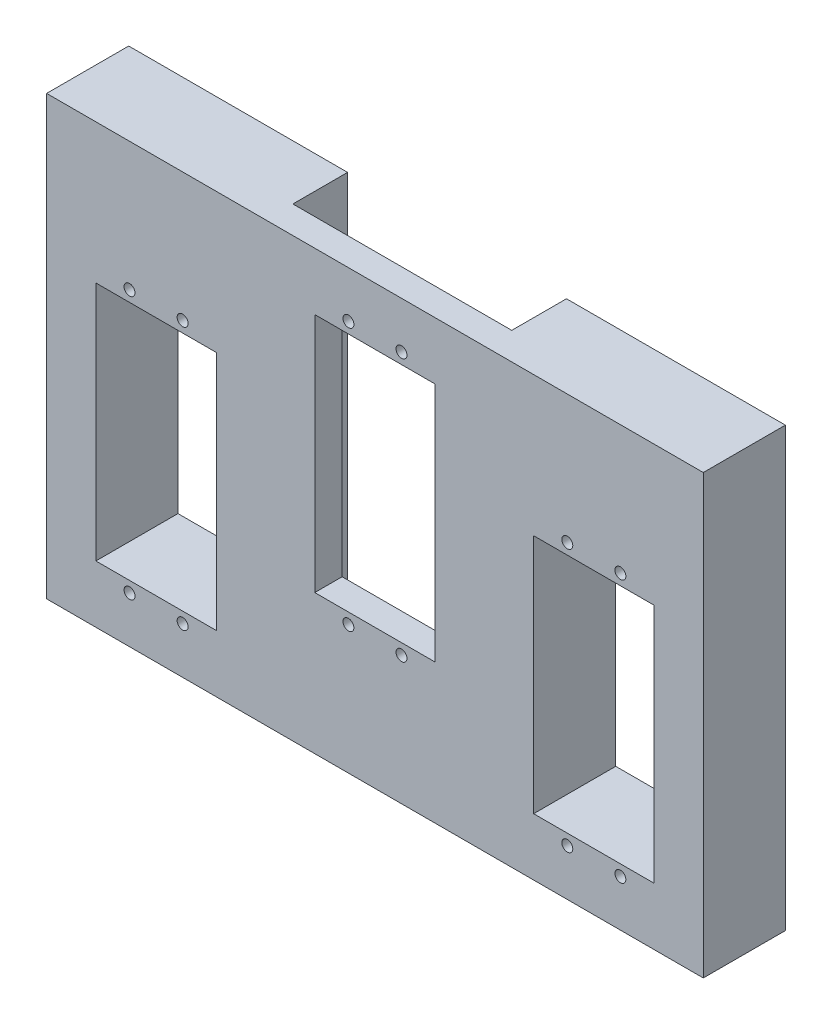
ISO-10303-21;
HEADER;
FILE_DESCRIPTION(('STEP AP214'),'2;1');
FILE_NAME('part.step','',(''),(''),'','','');
FILE_SCHEMA(('AUTOMOTIVE_DESIGN { 1 0 10303 214 1 1 1 1 }'));
ENDSEC;
DATA;
#1=APPLICATION_CONTEXT('core data for automotive mechanical design processes');
#2=APPLICATION_PROTOCOL_DEFINITION('international standard','automotive_design',2000,#1);
#3=PRODUCT_CONTEXT('',#1,'mechanical');
#4=PRODUCT('Part','Part','',(#3));
#5=PRODUCT_RELATED_PRODUCT_CATEGORY('part','',(#4));
#6=PRODUCT_DEFINITION_FORMATION('','',#4);
#7=PRODUCT_DEFINITION_CONTEXT('part definition',#1,'design');
#8=PRODUCT_DEFINITION('design','',#6,#7);
#9=PRODUCT_DEFINITION_SHAPE('','',#8);
#10=(LENGTH_UNIT() NAMED_UNIT(*) SI_UNIT(.MILLI.,.METRE.));
#11=(NAMED_UNIT(*) PLANE_ANGLE_UNIT() SI_UNIT($,.RADIAN.));
#12=(NAMED_UNIT(*) SI_UNIT($,.STERADIAN.) SOLID_ANGLE_UNIT());
#13=UNCERTAINTY_MEASURE_WITH_UNIT(LENGTH_MEASURE(1.E-05),#10,'distance_accuracy_value','');
#14=(GEOMETRIC_REPRESENTATION_CONTEXT(3) GLOBAL_UNCERTAINTY_ASSIGNED_CONTEXT((#13)) GLOBAL_UNIT_ASSIGNED_CONTEXT((#10,
#11,#12)) REPRESENTATION_CONTEXT('',''));
#15=CARTESIAN_POINT('',(0.,0.,0.));
#16=DIRECTION('',(0.,0.,1.));
#17=DIRECTION('',(1.,0.,0.));
#18=AXIS2_PLACEMENT_3D('',#15,#16,#17);
#19=CARTESIAN_POINT('',(0.,0.,-7.5));
#20=DIRECTION('',(0.,0.,1.));
#21=DIRECTION('',(1.,0.,0.));
#22=AXIS2_PLACEMENT_3D('',#19,#20,#21);
#23=PLANE('',#22);
#24=DIRECTION('',(-1.,0.,0.));
#25=VECTOR('',#24,1.);
#26=CARTESIAN_POINT('',(-50.9999999999999,-29.5,-7.5));
#27=LINE('',#26,#25);
#28=CARTESIAN_POINT('',(-28.9999999999999,-29.5,-7.5));
#29=VERTEX_POINT('',#28);
#30=CARTESIAN_POINT('',(-50.9999999999999,-29.5,-7.5));
#31=VERTEX_POINT('',#30);
#32=EDGE_CURVE('E397',#29,#31,#27,.T.);
#33=ORIENTED_EDGE('',*,*,#32,.F.);
#34=DIRECTION('',(0.,-1.,0.));
#35=VECTOR('',#34,1.);
#36=CARTESIAN_POINT('',(-28.9999999999999,-29.5,-7.5));
#37=LINE('',#36,#35);
#38=CARTESIAN_POINT('',(-28.9999999999999,14.5,-7.5));
#39=VERTEX_POINT('',#38);
#40=EDGE_CURVE('E401',#39,#29,#37,.T.);
#41=ORIENTED_EDGE('',*,*,#40,.F.);
#42=DIRECTION('',(1.,0.,0.));
#43=VECTOR('',#42,1.);
#44=CARTESIAN_POINT('',(-50.9999999999999,14.5,-7.5));
#45=LINE('',#44,#43);
#46=CARTESIAN_POINT('',(-50.9999999999999,14.5,-7.5));
#47=VERTEX_POINT('',#46);
#48=EDGE_CURVE('E404',#47,#39,#45,.T.);
#49=ORIENTED_EDGE('',*,*,#48,.F.);
#50=DIRECTION('',(0.,1.,0.));
#51=VECTOR('',#50,1.);
#52=CARTESIAN_POINT('',(-50.9999999999999,-29.5,-7.5));
#53=LINE('',#52,#51);
#54=EDGE_CURVE('E393',#31,#47,#53,.T.);
#55=ORIENTED_EDGE('',*,*,#54,.F.);
#56=EDGE_LOOP('',(#33,#41,#49,#55));
#57=FACE_BOUND('',#56,.T.);
#58=CARTESIAN_POINT('',(-44.8499999999999,16.5,-7.5));
#59=DIRECTION('',(0.,0.,1.));
#60=DIRECTION('',(1.,0.,0.));
#61=AXIS2_PLACEMENT_3D('',#58,#59,#60);
#62=CIRCLE('',#61,0.999999999999998);
#63=CARTESIAN_POINT('',(-43.8499999999999,16.5,-7.5));
#64=VERTEX_POINT('',#63);
#65=EDGE_CURVE('E318',#64,#64,#62,.F.);
#66=ORIENTED_EDGE('',*,*,#65,.F.);
#67=EDGE_LOOP('',(#66));
#68=FACE_BOUND('',#67,.T.);
#69=CARTESIAN_POINT('',(-35.1499999999999,16.5,-7.5));
#70=DIRECTION('',(0.,0.,1.));
#71=DIRECTION('',(1.,0.,0.));
#72=AXIS2_PLACEMENT_3D('',#69,#70,#71);
#73=CIRCLE('',#72,0.999999999999998);
#74=CARTESIAN_POINT('',(-34.1499999999999,16.5,-7.5));
#75=VERTEX_POINT('',#74);
#76=EDGE_CURVE('E310',#75,#75,#73,.F.);
#77=ORIENTED_EDGE('',*,*,#76,.F.);
#78=EDGE_LOOP('',(#77));
#79=FACE_BOUND('',#78,.T.);
#80=CARTESIAN_POINT('',(-35.1499999999999,-31.5,-7.5));
#81=DIRECTION('',(0.,0.,1.));
#82=DIRECTION('',(1.,0.,0.));
#83=AXIS2_PLACEMENT_3D('',#80,#81,#82);
#84=CIRCLE('',#83,0.999999999999998);
#85=CARTESIAN_POINT('',(-34.1499999999999,-31.5,-7.5));
#86=VERTEX_POINT('',#85);
#87=EDGE_CURVE('E301',#86,#86,#84,.F.);
#88=ORIENTED_EDGE('',*,*,#87,.F.);
#89=EDGE_LOOP('',(#88));
#90=FACE_BOUND('',#89,.T.);
#91=CARTESIAN_POINT('',(-44.8499999999999,-31.5,-7.5));
#92=DIRECTION('',(0.,0.,1.));
#93=DIRECTION('',(1.,0.,0.));
#94=AXIS2_PLACEMENT_3D('',#91,#92,#93);
#95=CIRCLE('',#94,0.999999999999998);
#96=CARTESIAN_POINT('',(-43.8499999999999,-31.5,-7.5));
#97=VERTEX_POINT('',#96);
#98=EDGE_CURVE('E300',#97,#97,#95,.F.);
#99=ORIENTED_EDGE('',*,*,#98,.F.);
#100=EDGE_LOOP('',(#99));
#101=FACE_BOUND('',#100,.T.);
#102=DIRECTION('',(-1.,0.,0.));
#103=VECTOR('',#102,1.);
#104=CARTESIAN_POINT('',(60.,40.,-7.5));
#105=LINE('',#104,#103);
#106=CARTESIAN_POINT('',(-20.,40.,-7.5));
#107=VERTEX_POINT('',#106);
#108=CARTESIAN_POINT('',(-60.,40.,-7.5));
#109=VERTEX_POINT('',#108);
#110=EDGE_CURVE('E460',#107,#109,#105,.T.);
#111=ORIENTED_EDGE('',*,*,#110,.F.);
#112=DIRECTION('',(0.,1.,0.));
#113=VECTOR('',#112,1.);
#114=CARTESIAN_POINT('',(-20.,-81.2310562561766,-7.5));
#115=LINE('',#114,#113);
#116=CARTESIAN_POINT('',(-20.,-40.,-7.5));
#117=VERTEX_POINT('',#116);
#118=EDGE_CURVE('E193',#117,#107,#115,.T.);
#119=ORIENTED_EDGE('',*,*,#118,.F.);
#120=DIRECTION('',(1.,0.,0.));
#121=VECTOR('',#120,1.);
#122=CARTESIAN_POINT('',(60.,-40.,-7.5));
#123=LINE('',#122,#121);
#124=CARTESIAN_POINT('',(-60.,-40.,-7.5));
#125=VERTEX_POINT('',#124);
#126=EDGE_CURVE('E453',#125,#117,#123,.T.);
#127=ORIENTED_EDGE('',*,*,#126,.F.);
#128=DIRECTION('',(0.,-1.,0.));
#129=VECTOR('',#128,1.);
#130=CARTESIAN_POINT('',(-60.,-40.,-7.5));
#131=LINE('',#130,#129);
#132=EDGE_CURVE('E433',#109,#125,#131,.T.);
#133=ORIENTED_EDGE('',*,*,#132,.F.);
#134=EDGE_LOOP('',(#111,#119,#127,#133));
#135=FACE_BOUND('',#134,.T.);
#136=ADVANCED_FACE('F39',(#57,#68,#79,#90,#101,#135),#23,.F.);
#137=CARTESIAN_POINT('',(-60.,-40.,7.5));
#138=DIRECTION('',(1.,0.,0.));
#139=DIRECTION('',(0.,0.,-1.));
#140=AXIS2_PLACEMENT_3D('',#137,#138,#139);
#141=PLANE('',#140);
#142=ORIENTED_EDGE('',*,*,#132,.T.);
#143=DIRECTION('',(0.,0.,-1.));
#144=VECTOR('',#143,1.);
#145=CARTESIAN_POINT('',(-60.,-40.,7.5));
#146=LINE('',#145,#144);
#147=CARTESIAN_POINT('',(-60.,-40.,7.5));
#148=VERTEX_POINT('',#147);
#149=EDGE_CURVE('E48',#148,#125,#146,.T.);
#150=ORIENTED_EDGE('',*,*,#149,.F.);
#151=DIRECTION('',(0.,-1.,0.));
#152=VECTOR('',#151,1.);
#153=CARTESIAN_POINT('',(-60.,-40.,7.5));
#154=LINE('',#153,#152);
#155=CARTESIAN_POINT('',(-60.,40.,7.5));
#156=VERTEX_POINT('',#155);
#157=EDGE_CURVE('E434',#156,#148,#154,.T.);
#158=ORIENTED_EDGE('',*,*,#157,.F.);
#159=DIRECTION('',(0.,0.,-1.));
#160=VECTOR('',#159,1.);
#161=CARTESIAN_POINT('',(-60.,40.,7.5));
#162=LINE('',#161,#160);
#163=EDGE_CURVE('E448',#156,#109,#162,.T.);
#164=ORIENTED_EDGE('',*,*,#163,.T.);
#165=EDGE_LOOP('',(#142,#150,#158,#164));
#166=FACE_BOUND('',#165,.T.);
#167=ADVANCED_FACE('F41',(#166),#141,.F.);
#168=CARTESIAN_POINT('',(60.,-40.,7.5));
#169=DIRECTION('',(0.,1.,0.));
#170=DIRECTION('',(-1.,0.,0.));
#171=AXIS2_PLACEMENT_3D('',#168,#169,#170);
#172=PLANE('',#171);
#173=ORIENTED_EDGE('',*,*,#126,.T.);
#174=DIRECTION('',(0.,0.,-1.));
#175=VECTOR('',#174,1.);
#176=CARTESIAN_POINT('',(-20.,-40.,2.5));
#177=LINE('',#176,#175);
#178=CARTESIAN_POINT('',(-20.,-40.,2.5));
#179=VERTEX_POINT('',#178);
#180=EDGE_CURVE('E217',#179,#117,#177,.T.);
#181=ORIENTED_EDGE('',*,*,#180,.F.);
#182=DIRECTION('',(-1.,0.,0.));
#183=VECTOR('',#182,1.);
#184=CARTESIAN_POINT('',(20.,-40.,2.5));
#185=LINE('',#184,#183);
#186=CARTESIAN_POINT('',(20.,-40.,2.5));
#187=VERTEX_POINT('',#186);
#188=EDGE_CURVE('E183',#187,#179,#185,.T.);
#189=ORIENTED_EDGE('',*,*,#188,.F.);
#190=DIRECTION('',(0.,0.,1.));
#191=VECTOR('',#190,1.);
#192=CARTESIAN_POINT('',(20.,-40.,2.5));
#193=LINE('',#192,#191);
#194=CARTESIAN_POINT('',(20.,-40.,-7.5));
#195=VERTEX_POINT('',#194);
#196=EDGE_CURVE('E208',#195,#187,#193,.T.);
#197=ORIENTED_EDGE('',*,*,#196,.F.);
#198=CARTESIAN_POINT('',(60.,-40.,-7.5));
#199=VERTEX_POINT('',#198);
#200=EDGE_CURVE('E452',#195,#199,#123,.T.);
#201=ORIENTED_EDGE('',*,*,#200,.T.);
#202=DIRECTION('',(0.,0.,-1.));
#203=VECTOR('',#202,1.);
#204=CARTESIAN_POINT('',(60.,-40.,7.5));
#205=LINE('',#204,#203);
#206=CARTESIAN_POINT('',(60.,-40.,7.5));
#207=VERTEX_POINT('',#206);
#208=EDGE_CURVE('E470',#207,#199,#205,.T.);
#209=ORIENTED_EDGE('',*,*,#208,.F.);
#210=DIRECTION('',(1.,0.,0.));
#211=VECTOR('',#210,1.);
#212=CARTESIAN_POINT('',(60.,-40.,7.5));
#213=LINE('',#212,#211);
#214=EDGE_CURVE('E438',#148,#207,#213,.T.);
#215=ORIENTED_EDGE('',*,*,#214,.F.);
#216=ORIENTED_EDGE('',*,*,#149,.T.);
#217=EDGE_LOOP('',(#173,#181,#189,#197,#201,#209,#215,#216));
#218=FACE_BOUND('',#217,.T.);
#219=ADVANCED_FACE('F477',(#218),#172,.F.);
#220=CARTESIAN_POINT('',(60.,-40.,7.5));
#221=DIRECTION('',(-1.,0.,0.));
#222=DIRECTION('',(0.,-1.,0.));
#223=AXIS2_PLACEMENT_3D('',#220,#221,#222);
#224=PLANE('',#223);
#225=DIRECTION('',(0.,1.,0.));
#226=VECTOR('',#225,1.);
#227=CARTESIAN_POINT('',(60.,-40.,-7.5));
#228=LINE('',#227,#226);
#229=CARTESIAN_POINT('',(60.,40.,-7.5));
#230=VERTEX_POINT('',#229);
#231=EDGE_CURVE('E457',#199,#230,#228,.T.);
#232=ORIENTED_EDGE('',*,*,#231,.T.);
#233=DIRECTION('',(0.,0.,-1.));
#234=VECTOR('',#233,1.);
#235=CARTESIAN_POINT('',(60.,40.,7.5));
#236=LINE('',#235,#234);
#237=CARTESIAN_POINT('',(60.,40.,7.5));
#238=VERTEX_POINT('',#237);
#239=EDGE_CURVE('E466',#238,#230,#236,.T.);
#240=ORIENTED_EDGE('',*,*,#239,.F.);
#241=DIRECTION('',(0.,1.,0.));
#242=VECTOR('',#241,1.);
#243=CARTESIAN_POINT('',(60.,-40.,7.5));
#244=LINE('',#243,#242);
#245=EDGE_CURVE('E442',#207,#238,#244,.T.);
#246=ORIENTED_EDGE('',*,*,#245,.F.);
#247=ORIENTED_EDGE('',*,*,#208,.T.);
#248=EDGE_LOOP('',(#232,#240,#246,#247));
#249=FACE_BOUND('',#248,.T.);
#250=ADVANCED_FACE('F498',(#249),#224,.F.);
#251=CARTESIAN_POINT('',(60.,40.,7.5));
#252=DIRECTION('',(0.,-1.,0.));
#253=DIRECTION('',(1.,0.,0.));
#254=AXIS2_PLACEMENT_3D('',#251,#252,#253);
#255=PLANE('',#254);
#256=DIRECTION('',(1.,0.,0.));
#257=VECTOR('',#256,1.);
#258=CARTESIAN_POINT('',(20.,40.,2.5));
#259=LINE('',#258,#257);
#260=CARTESIAN_POINT('',(-20.,40.,2.5));
#261=VERTEX_POINT('',#260);
#262=CARTESIAN_POINT('',(20.,40.,2.5));
#263=VERTEX_POINT('',#262);
#264=EDGE_CURVE('E181',#261,#263,#259,.T.);
#265=ORIENTED_EDGE('',*,*,#264,.F.);
#266=DIRECTION('',(0.,0.,1.));
#267=VECTOR('',#266,1.);
#268=CARTESIAN_POINT('',(-20.,40.,2.5));
#269=LINE('',#268,#267);
#270=EDGE_CURVE('E190',#107,#261,#269,.T.);
#271=ORIENTED_EDGE('',*,*,#270,.F.);
#272=ORIENTED_EDGE('',*,*,#110,.T.);
#273=ORIENTED_EDGE('',*,*,#163,.F.);
#274=DIRECTION('',(-1.,0.,0.));
#275=VECTOR('',#274,1.);
#276=CARTESIAN_POINT('',(60.,40.,7.5));
#277=LINE('',#276,#275);
#278=EDGE_CURVE('E445',#238,#156,#277,.T.);
#279=ORIENTED_EDGE('',*,*,#278,.F.);
#280=ORIENTED_EDGE('',*,*,#239,.T.);
#281=CARTESIAN_POINT('',(20.,40.,-7.5));
#282=VERTEX_POINT('',#281);
#283=EDGE_CURVE('E439',#230,#282,#105,.T.);
#284=ORIENTED_EDGE('',*,*,#283,.T.);
#285=DIRECTION('',(0.,0.,-1.));
#286=VECTOR('',#285,1.);
#287=CARTESIAN_POINT('',(20.,40.,2.5));
#288=LINE('',#287,#286);
#289=EDGE_CURVE('E55',#263,#282,#288,.T.);
#290=ORIENTED_EDGE('',*,*,#289,.F.);
#291=EDGE_LOOP('',(#265,#271,#272,#273,#279,#280,#284,#290));
#292=FACE_BOUND('',#291,.T.);
#293=ADVANCED_FACE('F198',(#292),#255,.F.);
#294=CARTESIAN_POINT('',(0.,0.,7.5));
#295=DIRECTION('',(0.,0.,1.));
#296=DIRECTION('',(1.,0.,0.));
#297=AXIS2_PLACEMENT_3D('',#294,#295,#296);
#298=PLANE('',#297);
#299=CARTESIAN_POINT('',(-44.8499999999999,-31.5,7.5));
#300=DIRECTION('',(0.,0.,1.));
#301=DIRECTION('',(1.,0.,0.));
#302=AXIS2_PLACEMENT_3D('',#299,#300,#301);
#303=CIRCLE('',#302,0.999999999999998);
#304=CARTESIAN_POINT('',(-43.8499999999999,-31.5,7.5));
#305=VERTEX_POINT('',#304);
#306=EDGE_CURVE('E296',#305,#305,#303,.T.);
#307=ORIENTED_EDGE('',*,*,#306,.F.);
#308=EDGE_LOOP('',(#307));
#309=FACE_BOUND('',#308,.T.);
#310=CARTESIAN_POINT('',(-35.1499999999999,-31.5,7.5));
#311=DIRECTION('',(0.,0.,1.));
#312=DIRECTION('',(1.,0.,0.));
#313=AXIS2_PLACEMENT_3D('',#310,#311,#312);
#314=CIRCLE('',#313,0.999999999999998);
#315=CARTESIAN_POINT('',(-34.1499999999999,-31.5,7.5));
#316=VERTEX_POINT('',#315);
#317=EDGE_CURVE('E306',#316,#316,#314,.T.);
#318=ORIENTED_EDGE('',*,*,#317,.F.);
#319=EDGE_LOOP('',(#318));
#320=FACE_BOUND('',#319,.T.);
#321=CARTESIAN_POINT('',(-35.1499999999999,16.5,7.5));
#322=DIRECTION('',(0.,0.,1.));
#323=DIRECTION('',(1.,0.,0.));
#324=AXIS2_PLACEMENT_3D('',#321,#322,#323);
#325=CIRCLE('',#324,0.999999999999998);
#326=CARTESIAN_POINT('',(-34.1499999999999,16.5,7.5));
#327=VERTEX_POINT('',#326);
#328=EDGE_CURVE('E314',#327,#327,#325,.T.);
#329=ORIENTED_EDGE('',*,*,#328,.F.);
#330=EDGE_LOOP('',(#329));
#331=FACE_BOUND('',#330,.T.);
#332=CARTESIAN_POINT('',(-44.8499999999999,16.5,7.5));
#333=DIRECTION('',(0.,0.,1.));
#334=DIRECTION('',(1.,0.,0.));
#335=AXIS2_PLACEMENT_3D('',#332,#333,#334);
#336=CIRCLE('',#335,0.999999999999998);
#337=CARTESIAN_POINT('',(-43.8499999999999,16.5,7.5));
#338=VERTEX_POINT('',#337);
#339=EDGE_CURVE('E322',#338,#338,#336,.T.);
#340=ORIENTED_EDGE('',*,*,#339,.F.);
#341=EDGE_LOOP('',(#340));
#342=FACE_BOUND('',#341,.T.);
#343=CARTESIAN_POINT('',(44.8499999999999,16.5,7.5));
#344=DIRECTION('',(0.,0.,1.));
#345=DIRECTION('',(1.,0.,0.));
#346=AXIS2_PLACEMENT_3D('',#343,#344,#345);
#347=CIRCLE('',#346,0.999999999999998);
#348=CARTESIAN_POINT('',(45.8499999999999,16.5,7.5));
#349=VERTEX_POINT('',#348);
#350=EDGE_CURVE('E253',#349,#349,#347,.T.);
#351=ORIENTED_EDGE('',*,*,#350,.F.);
#352=EDGE_LOOP('',(#351));
#353=FACE_BOUND('',#352,.T.);
#354=CARTESIAN_POINT('',(44.8499999999999,-31.5,7.5));
#355=DIRECTION('',(0.,0.,1.));
#356=DIRECTION('',(1.,0.,0.));
#357=AXIS2_PLACEMENT_3D('',#354,#355,#356);
#358=CIRCLE('',#357,0.999999999999998);
#359=CARTESIAN_POINT('',(45.8499999999999,-31.5,7.5));
#360=VERTEX_POINT('',#359);
#361=EDGE_CURVE('E330',#360,#360,#358,.T.);
#362=ORIENTED_EDGE('',*,*,#361,.F.);
#363=EDGE_LOOP('',(#362));
#364=FACE_BOUND('',#363,.T.);
#365=CARTESIAN_POINT('',(35.1499999999999,-31.5,7.5));
#366=DIRECTION('',(0.,0.,1.));
#367=DIRECTION('',(1.,0.,0.));
#368=AXIS2_PLACEMENT_3D('',#365,#366,#367);
#369=CIRCLE('',#368,0.999999999999998);
#370=CARTESIAN_POINT('',(36.1499999999999,-31.5,7.5));
#371=VERTEX_POINT('',#370);
#372=EDGE_CURVE('E339',#371,#371,#369,.T.);
#373=ORIENTED_EDGE('',*,*,#372,.F.);
#374=EDGE_LOOP('',(#373));
#375=FACE_BOUND('',#374,.T.);
#376=DIRECTION('',(0.,1.,0.));
#377=VECTOR('',#376,1.);
#378=CARTESIAN_POINT('',(50.9999999999999,-29.5,7.5));
#379=LINE('',#378,#377);
#380=CARTESIAN_POINT('',(50.9999999999999,-29.5,7.5));
#381=VERTEX_POINT('',#380);
#382=CARTESIAN_POINT('',(50.9999999999999,14.5,7.5));
#383=VERTEX_POINT('',#382);
#384=EDGE_CURVE('E357',#381,#383,#379,.T.);
#385=ORIENTED_EDGE('',*,*,#384,.F.);
#386=DIRECTION('',(1.,0.,0.));
#387=VECTOR('',#386,1.);
#388=CARTESIAN_POINT('',(28.9999999999999,-29.5,7.5));
#389=LINE('',#388,#387);
#390=CARTESIAN_POINT('',(28.9999999999999,-29.5,7.5));
#391=VERTEX_POINT('',#390);
#392=EDGE_CURVE('E369',#391,#381,#389,.T.);
#393=ORIENTED_EDGE('',*,*,#392,.F.);
#394=DIRECTION('',(0.,-1.,0.));
#395=VECTOR('',#394,1.);
#396=CARTESIAN_POINT('',(28.9999999999999,-29.5,7.5));
#397=LINE('',#396,#395);
#398=CARTESIAN_POINT('',(28.9999999999999,14.5,7.5));
#399=VERTEX_POINT('',#398);
#400=EDGE_CURVE('E365',#399,#391,#397,.T.);
#401=ORIENTED_EDGE('',*,*,#400,.F.);
#402=DIRECTION('',(-1.,0.,0.));
#403=VECTOR('',#402,1.);
#404=CARTESIAN_POINT('',(28.9999999999999,14.5,7.5));
#405=LINE('',#404,#403);
#406=EDGE_CURVE('E360',#383,#399,#405,.T.);
#407=ORIENTED_EDGE('',*,*,#406,.F.);
#408=EDGE_LOOP('',(#385,#393,#401,#407));
#409=FACE_BOUND('',#408,.T.);
#410=CARTESIAN_POINT('',(35.1499999999999,16.5,7.5));
#411=DIRECTION('',(0.,0.,1.));
#412=DIRECTION('',(1.,0.,0.));
#413=AXIS2_PLACEMENT_3D('',#410,#411,#412);
#414=CIRCLE('',#413,0.999999999999998);
#415=CARTESIAN_POINT('',(36.1499999999999,16.5,7.5));
#416=VERTEX_POINT('',#415);
#417=EDGE_CURVE('E244',#416,#416,#414,.T.);
#418=ORIENTED_EDGE('',*,*,#417,.F.);
#419=EDGE_LOOP('',(#418));
#420=FACE_BOUND('',#419,.T.);
#421=DIRECTION('',(0.,1.,0.));
#422=VECTOR('',#421,1.);
#423=CARTESIAN_POINT('',(11.0000000000001,-14.5,7.5));
#424=LINE('',#423,#422);
#425=CARTESIAN_POINT('',(11.0000000000001,-14.5,7.5));
#426=VERTEX_POINT('',#425);
#427=CARTESIAN_POINT('',(11.0000000000001,29.5,7.5));
#428=VERTEX_POINT('',#427);
#429=EDGE_CURVE('E254',#426,#428,#424,.T.);
#430=ORIENTED_EDGE('',*,*,#429,.F.);
#431=DIRECTION('',(1.,0.,0.));
#432=VECTOR('',#431,1.);
#433=CARTESIAN_POINT('',(-10.9999999999999,-14.5,7.5));
#434=LINE('',#433,#432);
#435=CARTESIAN_POINT('',(-10.9999999999999,-14.5,7.5));
#436=VERTEX_POINT('',#435);
#437=EDGE_CURVE('E267',#436,#426,#434,.T.);
#438=ORIENTED_EDGE('',*,*,#437,.F.);
#439=DIRECTION('',(0.,-1.,0.));
#440=VECTOR('',#439,1.);
#441=CARTESIAN_POINT('',(-10.9999999999999,-14.5,7.5));
#442=LINE('',#441,#440);
#443=CARTESIAN_POINT('',(-10.9999999999999,29.5,7.5));
#444=VERTEX_POINT('',#443);
#445=EDGE_CURVE('E263',#444,#436,#442,.T.);
#446=ORIENTED_EDGE('',*,*,#445,.F.);
#447=DIRECTION('',(-1.,0.,0.));
#448=VECTOR('',#447,1.);
#449=CARTESIAN_POINT('',(-10.9999999999999,29.5,7.5));
#450=LINE('',#449,#448);
#451=EDGE_CURVE('E258',#428,#444,#450,.T.);
#452=ORIENTED_EDGE('',*,*,#451,.F.);
#453=EDGE_LOOP('',(#430,#438,#446,#452));
#454=FACE_BOUND('',#453,.T.);
#455=CARTESIAN_POINT('',(-4.84999999999986,-16.5,7.5));
#456=DIRECTION('',(0.,0.,1.));
#457=DIRECTION('',(1.,0.,0.));
#458=AXIS2_PLACEMENT_3D('',#455,#456,#457);
#459=CIRCLE('',#458,0.999999999999998);
#460=CARTESIAN_POINT('',(-3.84999999999986,-16.5,7.5));
#461=VERTEX_POINT('',#460);
#462=EDGE_CURVE('E259',#461,#461,#459,.T.);
#463=ORIENTED_EDGE('',*,*,#462,.F.);
#464=EDGE_LOOP('',(#463));
#465=FACE_BOUND('',#464,.T.);
#466=CARTESIAN_POINT('',(4.85000000000014,-16.5,7.5));
#467=DIRECTION('',(0.,0.,1.));
#468=DIRECTION('',(1.,0.,0.));
#469=AXIS2_PLACEMENT_3D('',#466,#467,#468);
#470=CIRCLE('',#469,0.999999999999998);
#471=CARTESIAN_POINT('',(5.85000000000014,-16.5,7.5));
#472=VERTEX_POINT('',#471);
#473=EDGE_CURVE('E285',#472,#472,#470,.T.);
#474=ORIENTED_EDGE('',*,*,#473,.F.);
#475=EDGE_LOOP('',(#474));
#476=FACE_BOUND('',#475,.T.);
#477=CARTESIAN_POINT('',(4.85000000000014,31.5,7.5));
#478=DIRECTION('',(0.,0.,1.));
#479=DIRECTION('',(1.,0.,0.));
#480=AXIS2_PLACEMENT_3D('',#477,#478,#479);
#481=CIRCLE('',#480,0.999999999999999);
#482=CARTESIAN_POINT('',(5.85000000000014,31.5,7.5));
#483=VERTEX_POINT('',#482);
#484=EDGE_CURVE('E289',#483,#483,#481,.T.);
#485=ORIENTED_EDGE('',*,*,#484,.F.);
#486=EDGE_LOOP('',(#485));
#487=FACE_BOUND('',#486,.T.);
#488=CARTESIAN_POINT('',(-4.84999999999986,31.5,7.5));
#489=DIRECTION('',(0.,0.,1.));
#490=DIRECTION('',(1.,0.,0.));
#491=AXIS2_PLACEMENT_3D('',#488,#489,#490);
#492=CIRCLE('',#491,0.999999999999999);
#493=CARTESIAN_POINT('',(-3.84999999999986,31.5,7.5));
#494=VERTEX_POINT('',#493);
#495=EDGE_CURVE('E243',#494,#494,#492,.T.);
#496=ORIENTED_EDGE('',*,*,#495,.F.);
#497=EDGE_LOOP('',(#496));
#498=FACE_BOUND('',#497,.T.);
#499=DIRECTION('',(0.,1.,0.));
#500=VECTOR('',#499,1.);
#501=CARTESIAN_POINT('',(-28.9999999999999,-29.5,7.5));
#502=LINE('',#501,#500);
#503=CARTESIAN_POINT('',(-28.9999999999999,-29.5,7.5));
#504=VERTEX_POINT('',#503);
#505=CARTESIAN_POINT('',(-28.9999999999999,14.5,7.5));
#506=VERTEX_POINT('',#505);
#507=EDGE_CURVE('E305',#504,#506,#502,.T.);
#508=ORIENTED_EDGE('',*,*,#507,.F.);
#509=DIRECTION('',(1.,0.,0.));
#510=VECTOR('',#509,1.);
#511=CARTESIAN_POINT('',(-50.9999999999999,-29.5,7.5));
#512=LINE('',#511,#510);
#513=CARTESIAN_POINT('',(-50.9999999999999,-29.5,7.5));
#514=VERTEX_POINT('',#513);
#515=EDGE_CURVE('E415',#514,#504,#512,.T.);
#516=ORIENTED_EDGE('',*,*,#515,.F.);
#517=DIRECTION('',(0.,-1.,0.));
#518=VECTOR('',#517,1.);
#519=CARTESIAN_POINT('',(-50.9999999999999,-29.5,7.5));
#520=LINE('',#519,#518);
#521=CARTESIAN_POINT('',(-50.9999999999999,14.5,7.5));
#522=VERTEX_POINT('',#521);
#523=EDGE_CURVE('E411',#522,#514,#520,.T.);
#524=ORIENTED_EDGE('',*,*,#523,.F.);
#525=DIRECTION('',(-1.,0.,0.));
#526=VECTOR('',#525,1.);
#527=CARTESIAN_POINT('',(-50.9999999999999,14.5,7.5));
#528=LINE('',#527,#526);
#529=EDGE_CURVE('E407',#506,#522,#528,.T.);
#530=ORIENTED_EDGE('',*,*,#529,.F.);
#531=EDGE_LOOP('',(#508,#516,#524,#530));
#532=FACE_BOUND('',#531,.T.);
#533=ORIENTED_EDGE('',*,*,#157,.T.);
#534=ORIENTED_EDGE('',*,*,#214,.T.);
#535=ORIENTED_EDGE('',*,*,#245,.T.);
#536=ORIENTED_EDGE('',*,*,#278,.T.);
#537=EDGE_LOOP('',(#533,#534,#535,#536));
#538=FACE_BOUND('',#537,.T.);
#539=ADVANCED_FACE('F502',(#309,#320,#331,#342,#353,#364,#375,#409,#420,#454,#465,#476,#487,
#498,#532,#538),#298,.T.);
#540=CARTESIAN_POINT('',(44.8499999999999,16.5,-7.5));
#541=DIRECTION('',(0.,0.,1.));
#542=DIRECTION('',(1.,0.,0.));
#543=AXIS2_PLACEMENT_3D('',#540,#541,#542);
#544=CIRCLE('',#543,0.999999999999998);
#545=CARTESIAN_POINT('',(45.8499999999999,16.5,-7.5));
#546=VERTEX_POINT('',#545);
#547=EDGE_CURVE('E335',#546,#546,#544,.F.);
#548=ORIENTED_EDGE('',*,*,#547,.F.);
#549=EDGE_LOOP('',(#548));
#550=FACE_BOUND('',#549,.T.);
#551=CARTESIAN_POINT('',(44.8499999999999,-31.5,-7.5));
#552=DIRECTION('',(0.,0.,1.));
#553=DIRECTION('',(1.,0.,0.));
#554=AXIS2_PLACEMENT_3D('',#551,#552,#553);
#555=CIRCLE('',#554,0.999999999999998);
#556=CARTESIAN_POINT('',(45.8499999999999,-31.5,-7.5));
#557=VERTEX_POINT('',#556);
#558=EDGE_CURVE('E334',#557,#557,#555,.F.);
#559=ORIENTED_EDGE('',*,*,#558,.F.);
#560=EDGE_LOOP('',(#559));
#561=FACE_BOUND('',#560,.T.);
#562=CARTESIAN_POINT('',(35.1499999999999,-31.5,-7.5));
#563=DIRECTION('',(0.,0.,1.));
#564=DIRECTION('',(1.,0.,0.));
#565=AXIS2_PLACEMENT_3D('',#562,#563,#564);
#566=CIRCLE('',#565,0.999999999999998);
#567=CARTESIAN_POINT('',(36.1499999999999,-31.5,-7.5));
#568=VERTEX_POINT('',#567);
#569=EDGE_CURVE('E361',#568,#568,#566,.F.);
#570=ORIENTED_EDGE('',*,*,#569,.F.);
#571=EDGE_LOOP('',(#570));
#572=FACE_BOUND('',#571,.T.);
#573=DIRECTION('',(-1.,0.,0.));
#574=VECTOR('',#573,1.);
#575=CARTESIAN_POINT('',(28.9999999999999,-29.5,-7.5));
#576=LINE('',#575,#574);
#577=CARTESIAN_POINT('',(50.9999999999999,-29.5,-7.5));
#578=VERTEX_POINT('',#577);
#579=CARTESIAN_POINT('',(28.9999999999999,-29.5,-7.5));
#580=VERTEX_POINT('',#579);
#581=EDGE_CURVE('E350',#578,#580,#576,.T.);
#582=ORIENTED_EDGE('',*,*,#581,.F.);
#583=DIRECTION('',(0.,-1.,0.));
#584=VECTOR('',#583,1.);
#585=CARTESIAN_POINT('',(50.9999999999999,-29.5,-7.5));
#586=LINE('',#585,#584);
#587=CARTESIAN_POINT('',(50.9999999999999,14.5,-7.5));
#588=VERTEX_POINT('',#587);
#589=EDGE_CURVE('E354',#588,#578,#586,.T.);
#590=ORIENTED_EDGE('',*,*,#589,.F.);
#591=DIRECTION('',(1.,0.,0.));
#592=VECTOR('',#591,1.);
#593=CARTESIAN_POINT('',(28.9999999999999,14.5,-7.5));
#594=LINE('',#593,#592);
#595=CARTESIAN_POINT('',(28.9999999999999,14.5,-7.5));
#596=VERTEX_POINT('',#595);
#597=EDGE_CURVE('E326',#596,#588,#594,.T.);
#598=ORIENTED_EDGE('',*,*,#597,.F.);
#599=DIRECTION('',(0.,1.,0.));
#600=VECTOR('',#599,1.);
#601=CARTESIAN_POINT('',(28.9999999999999,-29.5,-7.5));
#602=LINE('',#601,#600);
#603=EDGE_CURVE('E346',#580,#596,#602,.T.);
#604=ORIENTED_EDGE('',*,*,#603,.F.);
#605=EDGE_LOOP('',(#582,#590,#598,#604));
#606=FACE_BOUND('',#605,.T.);
#607=CARTESIAN_POINT('',(35.1499999999999,16.5,-7.5));
#608=DIRECTION('',(0.,0.,1.));
#609=DIRECTION('',(1.,0.,0.));
#610=AXIS2_PLACEMENT_3D('',#607,#608,#609);
#611=CIRCLE('',#610,0.999999999999998);
#612=CARTESIAN_POINT('',(36.1499999999999,16.5,-7.5));
#613=VERTEX_POINT('',#612);
#614=EDGE_CURVE('E248',#613,#613,#611,.F.);
#615=ORIENTED_EDGE('',*,*,#614,.F.);
#616=EDGE_LOOP('',(#615));
#617=FACE_BOUND('',#616,.T.);
#618=ORIENTED_EDGE('',*,*,#200,.F.);
#619=DIRECTION('',(0.,1.,0.));
#620=VECTOR('',#619,1.);
#621=CARTESIAN_POINT('',(20.,-81.2310562561766,-7.5));
#622=LINE('',#621,#620);
#623=EDGE_CURVE('E209',#195,#282,#622,.T.);
#624=ORIENTED_EDGE('',*,*,#623,.T.);
#625=ORIENTED_EDGE('',*,*,#283,.F.);
#626=ORIENTED_EDGE('',*,*,#231,.F.);
#627=EDGE_LOOP('',(#618,#624,#625,#626));
#628=FACE_BOUND('',#627,.T.);
#629=ADVANCED_FACE('F494',(#550,#561,#572,#606,#617,#628),#23,.F.);
#630=CARTESIAN_POINT('',(-28.9999999999999,-29.5,-56.6934955049954));
#631=DIRECTION('',(1.,0.,0.));
#632=DIRECTION('',(0.,0.,-1.));
#633=AXIS2_PLACEMENT_3D('',#630,#631,#632);
#634=PLANE('',#633);
#635=ORIENTED_EDGE('',*,*,#40,.T.);
#636=DIRECTION('',(0.,0.,1.));
#637=VECTOR('',#636,1.);
#638=CARTESIAN_POINT('',(-28.9999999999999,-29.5,-56.6934955049954));
#639=LINE('',#638,#637);
#640=EDGE_CURVE('E398',#29,#504,#639,.T.);
#641=ORIENTED_EDGE('',*,*,#640,.T.);
#642=ORIENTED_EDGE('',*,*,#507,.T.);
#643=DIRECTION('',(0.,0.,1.));
#644=VECTOR('',#643,1.);
#645=CARTESIAN_POINT('',(-28.9999999999999,14.5,-56.6934955049954));
#646=LINE('',#645,#644);
#647=EDGE_CURVE('E419',#39,#506,#646,.T.);
#648=ORIENTED_EDGE('',*,*,#647,.F.);
#649=EDGE_LOOP('',(#635,#641,#642,#648));
#650=FACE_BOUND('',#649,.T.);
#651=ADVANCED_FACE('F510',(#650),#634,.F.);
#652=CARTESIAN_POINT('',(-50.9999999999999,-29.5,-56.6934955049954));
#653=DIRECTION('',(0.,-1.,0.));
#654=DIRECTION('',(0.,0.,-1.));
#655=AXIS2_PLACEMENT_3D('',#652,#653,#654);
#656=PLANE('',#655);
#657=ORIENTED_EDGE('',*,*,#32,.T.);
#658=DIRECTION('',(0.,0.,1.));
#659=VECTOR('',#658,1.);
#660=CARTESIAN_POINT('',(-50.9999999999999,-29.5,-56.6934955049954));
#661=LINE('',#660,#659);
#662=EDGE_CURVE('E422',#31,#514,#661,.T.);
#663=ORIENTED_EDGE('',*,*,#662,.T.);
#664=ORIENTED_EDGE('',*,*,#515,.T.);
#665=ORIENTED_EDGE('',*,*,#640,.F.);
#666=EDGE_LOOP('',(#657,#663,#664,#665));
#667=FACE_BOUND('',#666,.T.);
#668=ADVANCED_FACE('F711',(#667),#656,.F.);
#669=CARTESIAN_POINT('',(-50.9999999999999,-29.5,-56.6934955049954));
#670=DIRECTION('',(-1.,0.,0.));
#671=DIRECTION('',(0.,0.,1.));
#672=AXIS2_PLACEMENT_3D('',#669,#670,#671);
#673=PLANE('',#672);
#674=ORIENTED_EDGE('',*,*,#54,.T.);
#675=DIRECTION('',(0.,0.,1.));
#676=VECTOR('',#675,1.);
#677=CARTESIAN_POINT('',(-50.9999999999999,14.5,-56.6934955049954));
#678=LINE('',#677,#676);
#679=EDGE_CURVE('E425',#47,#522,#678,.T.);
#680=ORIENTED_EDGE('',*,*,#679,.T.);
#681=ORIENTED_EDGE('',*,*,#523,.T.);
#682=ORIENTED_EDGE('',*,*,#662,.F.);
#683=EDGE_LOOP('',(#674,#680,#681,#682));
#684=FACE_BOUND('',#683,.T.);
#685=ADVANCED_FACE('F714',(#684),#673,.F.);
#686=CARTESIAN_POINT('',(-50.9999999999999,14.5,-56.6934955049954));
#687=DIRECTION('',(0.,1.,0.));
#688=DIRECTION('',(0.,0.,1.));
#689=AXIS2_PLACEMENT_3D('',#686,#687,#688);
#690=PLANE('',#689);
#691=ORIENTED_EDGE('',*,*,#48,.T.);
#692=ORIENTED_EDGE('',*,*,#647,.T.);
#693=ORIENTED_EDGE('',*,*,#529,.T.);
#694=ORIENTED_EDGE('',*,*,#679,.F.);
#695=EDGE_LOOP('',(#691,#692,#693,#694));
#696=FACE_BOUND('',#695,.T.);
#697=ADVANCED_FACE('F559',(#696),#690,.F.);
#698=CARTESIAN_POINT('',(-4.84999999999986,31.5,-56.6934955049954));
#699=DIRECTION('',(0.,0.,1.));
#700=DIRECTION('',(1.,0.,0.));
#701=AXIS2_PLACEMENT_3D('',#698,#699,#700);
#702=CYLINDRICAL_SURFACE('',#701,0.999999999999999);
#703=CARTESIAN_POINT('',(-4.84999999999986,31.5,2.5));
#704=DIRECTION('',(0.,0.,1.));
#705=DIRECTION('',(1.,0.,0.));
#706=AXIS2_PLACEMENT_3D('',#703,#704,#705);
#707=CIRCLE('',#706,0.999999999999999);
#708=CARTESIAN_POINT('',(-3.84999999999986,31.5,2.5));
#709=VERTEX_POINT('',#708);
#710=EDGE_CURVE('E239',#709,#709,#707,.F.);
#711=ORIENTED_EDGE('',*,*,#710,.T.);
#712=EDGE_LOOP('',(#711));
#713=FACE_BOUND('',#712,.T.);
#714=ORIENTED_EDGE('',*,*,#495,.T.);
#715=EDGE_LOOP('',(#714));
#716=FACE_BOUND('',#715,.T.);
#717=ADVANCED_FACE('F553',(#713,#716),#702,.F.);
#718=CARTESIAN_POINT('',(4.85000000000014,31.5,-56.6934955049954));
#719=DIRECTION('',(0.,0.,1.));
#720=DIRECTION('',(1.,0.,0.));
#721=AXIS2_PLACEMENT_3D('',#718,#719,#720);
#722=CYLINDRICAL_SURFACE('',#721,0.999999999999999);
#723=CARTESIAN_POINT('',(4.85000000000014,31.5,2.5));
#724=DIRECTION('',(0.,0.,1.));
#725=DIRECTION('',(1.,0.,0.));
#726=AXIS2_PLACEMENT_3D('',#723,#724,#725);
#727=CIRCLE('',#726,0.999999999999999);
#728=CARTESIAN_POINT('',(5.85000000000014,31.5,2.5));
#729=VERTEX_POINT('',#728);
#730=EDGE_CURVE('E235',#729,#729,#727,.F.);
#731=ORIENTED_EDGE('',*,*,#730,.T.);
#732=EDGE_LOOP('',(#731));
#733=FACE_BOUND('',#732,.T.);
#734=ORIENTED_EDGE('',*,*,#484,.T.);
#735=EDGE_LOOP('',(#734));
#736=FACE_BOUND('',#735,.T.);
#737=ADVANCED_FACE('F558',(#733,#736),#722,.F.);
#738=CARTESIAN_POINT('',(4.85000000000014,-16.5,-56.6934955049954));
#739=DIRECTION('',(0.,0.,1.));
#740=DIRECTION('',(1.,0.,0.));
#741=AXIS2_PLACEMENT_3D('',#738,#739,#740);
#742=CYLINDRICAL_SURFACE('',#741,0.999999999999998);
#743=CARTESIAN_POINT('',(4.85000000000014,-16.5,2.5));
#744=DIRECTION('',(0.,0.,1.));
#745=DIRECTION('',(1.,0.,0.));
#746=AXIS2_PLACEMENT_3D('',#743,#744,#745);
#747=CIRCLE('',#746,0.999999999999998);
#748=CARTESIAN_POINT('',(5.85000000000014,-16.5,2.5));
#749=VERTEX_POINT('',#748);
#750=EDGE_CURVE('E231',#749,#749,#747,.F.);
#751=ORIENTED_EDGE('',*,*,#750,.T.);
#752=EDGE_LOOP('',(#751));
#753=FACE_BOUND('',#752,.T.);
#754=ORIENTED_EDGE('',*,*,#473,.T.);
#755=EDGE_LOOP('',(#754));
#756=FACE_BOUND('',#755,.T.);
#757=ADVANCED_FACE('F571',(#753,#756),#742,.F.);
#758=CARTESIAN_POINT('',(-4.84999999999986,-16.5,-56.6934955049954));
#759=DIRECTION('',(0.,0.,1.));
#760=DIRECTION('',(1.,0.,0.));
#761=AXIS2_PLACEMENT_3D('',#758,#759,#760);
#762=CYLINDRICAL_SURFACE('',#761,0.999999999999998);
#763=CARTESIAN_POINT('',(-4.84999999999986,-16.5,2.5));
#764=DIRECTION('',(0.,0.,1.));
#765=DIRECTION('',(1.,0.,0.));
#766=AXIS2_PLACEMENT_3D('',#763,#764,#765);
#767=CIRCLE('',#766,0.999999999999998);
#768=CARTESIAN_POINT('',(-3.84999999999986,-16.5,2.5));
#769=VERTEX_POINT('',#768);
#770=EDGE_CURVE('E227',#769,#769,#767,.F.);
#771=ORIENTED_EDGE('',*,*,#770,.T.);
#772=EDGE_LOOP('',(#771));
#773=FACE_BOUND('',#772,.T.);
#774=ORIENTED_EDGE('',*,*,#462,.T.);
#775=EDGE_LOOP('',(#774));
#776=FACE_BOUND('',#775,.T.);
#777=ADVANCED_FACE('F581',(#773,#776),#762,.F.);
#778=CARTESIAN_POINT('',(11.0000000000001,-14.5,-56.6934955049954));
#779=DIRECTION('',(1.,0.,0.));
#780=DIRECTION('',(0.,0.,-1.));
#781=AXIS2_PLACEMENT_3D('',#778,#779,#780);
#782=PLANE('',#781);
#783=DIRECTION('',(0.,0.,1.));
#784=VECTOR('',#783,1.);
#785=CARTESIAN_POINT('',(11.0000000000001,29.5,-56.6934955049954));
#786=LINE('',#785,#784);
#787=CARTESIAN_POINT('',(11.0000000000001,29.5,2.50000000000001));
#788=VERTEX_POINT('',#787);
#789=EDGE_CURVE('E271',#788,#428,#786,.T.);
#790=ORIENTED_EDGE('',*,*,#789,.F.);
#791=DIRECTION('',(0.,-1.,0.));
#792=VECTOR('',#791,1.);
#793=CARTESIAN_POINT('',(11.0000000000001,-14.5,2.5));
#794=LINE('',#793,#792);
#795=CARTESIAN_POINT('',(11.0000000000001,-14.5,2.50000000000001));
#796=VERTEX_POINT('',#795);
#797=EDGE_CURVE('E63',#788,#796,#794,.T.);
#798=ORIENTED_EDGE('',*,*,#797,.T.);
#799=DIRECTION('',(0.,0.,1.));
#800=VECTOR('',#799,1.);
#801=CARTESIAN_POINT('',(11.0000000000001,-14.5,-56.6934955049954));
#802=LINE('',#801,#800);
#803=EDGE_CURVE('E249',#796,#426,#802,.T.);
#804=ORIENTED_EDGE('',*,*,#803,.T.);
#805=ORIENTED_EDGE('',*,*,#429,.T.);
#806=EDGE_LOOP('',(#790,#798,#804,#805));
#807=FACE_BOUND('',#806,.T.);
#808=ADVANCED_FACE('F591',(#807),#782,.F.);
#809=CARTESIAN_POINT('',(-10.9999999999999,-14.5,-56.6934955049954));
#810=DIRECTION('',(0.,-1.,0.));
#811=DIRECTION('',(0.,0.,-1.));
#812=AXIS2_PLACEMENT_3D('',#809,#810,#811);
#813=PLANE('',#812);
#814=ORIENTED_EDGE('',*,*,#803,.F.);
#815=DIRECTION('',(-1.,0.,0.));
#816=VECTOR('',#815,1.);
#817=CARTESIAN_POINT('',(-10.9999999999999,-14.5,2.50000000000001));
#818=LINE('',#817,#816);
#819=CARTESIAN_POINT('',(-10.9999999999999,-14.5,2.50000000000001));
#820=VERTEX_POINT('',#819);
#821=EDGE_CURVE('E221',#796,#820,#818,.T.);
#822=ORIENTED_EDGE('',*,*,#821,.T.);
#823=DIRECTION('',(0.,0.,1.));
#824=VECTOR('',#823,1.);
#825=CARTESIAN_POINT('',(-10.9999999999999,-14.5,-56.6934955049954));
#826=LINE('',#825,#824);
#827=EDGE_CURVE('E274',#820,#436,#826,.T.);
#828=ORIENTED_EDGE('',*,*,#827,.T.);
#829=ORIENTED_EDGE('',*,*,#437,.T.);
#830=EDGE_LOOP('',(#814,#822,#828,#829));
#831=FACE_BOUND('',#830,.T.);
#832=ADVANCED_FACE('F601',(#831),#813,.F.);
#833=CARTESIAN_POINT('',(-10.9999999999999,-14.5,-56.6934955049954));
#834=DIRECTION('',(-1.,0.,0.));
#835=DIRECTION('',(0.,0.,1.));
#836=AXIS2_PLACEMENT_3D('',#833,#834,#835);
#837=PLANE('',#836);
#838=ORIENTED_EDGE('',*,*,#827,.F.);
#839=DIRECTION('',(0.,1.,0.));
#840=VECTOR('',#839,1.);
#841=CARTESIAN_POINT('',(-10.9999999999999,-14.5,2.50000000000001));
#842=LINE('',#841,#840);
#843=CARTESIAN_POINT('',(-10.9999999999999,29.5,2.50000000000001));
#844=VERTEX_POINT('',#843);
#845=EDGE_CURVE('E216',#820,#844,#842,.T.);
#846=ORIENTED_EDGE('',*,*,#845,.T.);
#847=DIRECTION('',(0.,0.,1.));
#848=VECTOR('',#847,1.);
#849=CARTESIAN_POINT('',(-10.9999999999999,29.5,-56.6934955049954));
#850=LINE('',#849,#848);
#851=EDGE_CURVE('E277',#844,#444,#850,.T.);
#852=ORIENTED_EDGE('',*,*,#851,.T.);
#853=ORIENTED_EDGE('',*,*,#445,.T.);
#854=EDGE_LOOP('',(#838,#846,#852,#853));
#855=FACE_BOUND('',#854,.T.);
#856=ADVANCED_FACE('F611',(#855),#837,.F.);
#857=CARTESIAN_POINT('',(-10.9999999999999,29.5,-56.6934955049954));
#858=DIRECTION('',(0.,1.,0.));
#859=DIRECTION('',(0.,0.,1.));
#860=AXIS2_PLACEMENT_3D('',#857,#858,#859);
#861=PLANE('',#860);
#862=ORIENTED_EDGE('',*,*,#851,.F.);
#863=DIRECTION('',(1.,0.,0.));
#864=VECTOR('',#863,1.);
#865=CARTESIAN_POINT('',(-10.9999999999999,29.5,2.50000000000001));
#866=LINE('',#865,#864);
#867=EDGE_CURVE('E11',#844,#788,#866,.T.);
#868=ORIENTED_EDGE('',*,*,#867,.T.);
#869=ORIENTED_EDGE('',*,*,#789,.T.);
#870=ORIENTED_EDGE('',*,*,#451,.T.);
#871=EDGE_LOOP('',(#862,#868,#869,#870));
#872=FACE_BOUND('',#871,.T.);
#873=ADVANCED_FACE('F621',(#872),#861,.F.);
#874=CARTESIAN_POINT('',(35.1499999999999,16.5,-56.6934955049954));
#875=DIRECTION('',(0.,0.,1.));
#876=DIRECTION('',(1.,0.,0.));
#877=AXIS2_PLACEMENT_3D('',#874,#875,#876);
#878=CYLINDRICAL_SURFACE('',#877,0.999999999999998);
#879=ORIENTED_EDGE('',*,*,#614,.T.);
#880=EDGE_LOOP('',(#879));
#881=FACE_BOUND('',#880,.T.);
#882=ORIENTED_EDGE('',*,*,#417,.T.);
#883=EDGE_LOOP('',(#882));
#884=FACE_BOUND('',#883,.T.);
#885=ADVANCED_FACE('F631',(#881,#884),#878,.F.);
#886=CARTESIAN_POINT('',(50.9999999999999,-29.5,-56.6934955049954));
#887=DIRECTION('',(1.,0.,0.));
#888=DIRECTION('',(0.,0.,-1.));
#889=AXIS2_PLACEMENT_3D('',#886,#887,#888);
#890=PLANE('',#889);
#891=ORIENTED_EDGE('',*,*,#589,.T.);
#892=DIRECTION('',(0.,0.,1.));
#893=VECTOR('',#892,1.);
#894=CARTESIAN_POINT('',(50.9999999999999,-29.5,-56.6934955049954));
#895=LINE('',#894,#893);
#896=EDGE_CURVE('E351',#578,#381,#895,.T.);
#897=ORIENTED_EDGE('',*,*,#896,.T.);
#898=ORIENTED_EDGE('',*,*,#384,.T.);
#899=DIRECTION('',(0.,0.,1.));
#900=VECTOR('',#899,1.);
#901=CARTESIAN_POINT('',(50.9999999999999,14.5,-56.6934955049954));
#902=LINE('',#901,#900);
#903=EDGE_CURVE('E373',#588,#383,#902,.T.);
#904=ORIENTED_EDGE('',*,*,#903,.F.);
#905=EDGE_LOOP('',(#891,#897,#898,#904));
#906=FACE_BOUND('',#905,.T.);
#907=ADVANCED_FACE('F667',(#906),#890,.F.);
#908=CARTESIAN_POINT('',(28.9999999999999,-29.5,-56.6934955049954));
#909=DIRECTION('',(0.,-1.,0.));
#910=DIRECTION('',(0.,0.,-1.));
#911=AXIS2_PLACEMENT_3D('',#908,#909,#910);
#912=PLANE('',#911);
#913=ORIENTED_EDGE('',*,*,#581,.T.);
#914=DIRECTION('',(0.,0.,1.));
#915=VECTOR('',#914,1.);
#916=CARTESIAN_POINT('',(28.9999999999999,-29.5,-56.6934955049954));
#917=LINE('',#916,#915);
#918=EDGE_CURVE('E376',#580,#391,#917,.T.);
#919=ORIENTED_EDGE('',*,*,#918,.T.);
#920=ORIENTED_EDGE('',*,*,#392,.T.);
#921=ORIENTED_EDGE('',*,*,#896,.F.);
#922=EDGE_LOOP('',(#913,#919,#920,#921));
#923=FACE_BOUND('',#922,.T.);
#924=ADVANCED_FACE('F693',(#923),#912,.F.);
#925=CARTESIAN_POINT('',(28.9999999999999,-29.5,-56.6934955049954));
#926=DIRECTION('',(-1.,0.,0.));
#927=DIRECTION('',(0.,0.,1.));
#928=AXIS2_PLACEMENT_3D('',#925,#926,#927);
#929=PLANE('',#928);
#930=ORIENTED_EDGE('',*,*,#603,.T.);
#931=DIRECTION('',(0.,0.,1.));
#932=VECTOR('',#931,1.);
#933=CARTESIAN_POINT('',(28.9999999999999,14.5,-56.6934955049954));
#934=LINE('',#933,#932);
#935=EDGE_CURVE('E379',#596,#399,#934,.T.);
#936=ORIENTED_EDGE('',*,*,#935,.T.);
#937=ORIENTED_EDGE('',*,*,#400,.T.);
#938=ORIENTED_EDGE('',*,*,#918,.F.);
#939=EDGE_LOOP('',(#930,#936,#937,#938));
#940=FACE_BOUND('',#939,.T.);
#941=ADVANCED_FACE('F696',(#940),#929,.F.);
#942=CARTESIAN_POINT('',(28.9999999999999,14.5,-56.6934955049954));
#943=DIRECTION('',(0.,1.,0.));
#944=DIRECTION('',(0.,0.,1.));
#945=AXIS2_PLACEMENT_3D('',#942,#943,#944);
#946=PLANE('',#945);
#947=ORIENTED_EDGE('',*,*,#597,.T.);
#948=ORIENTED_EDGE('',*,*,#903,.T.);
#949=ORIENTED_EDGE('',*,*,#406,.T.);
#950=ORIENTED_EDGE('',*,*,#935,.F.);
#951=EDGE_LOOP('',(#947,#948,#949,#950));
#952=FACE_BOUND('',#951,.T.);
#953=ADVANCED_FACE('F700',(#952),#946,.F.);
#954=CARTESIAN_POINT('',(35.1499999999999,-31.5,-56.6934955049954));
#955=DIRECTION('',(0.,0.,1.));
#956=DIRECTION('',(1.,0.,0.));
#957=AXIS2_PLACEMENT_3D('',#954,#955,#956);
#958=CYLINDRICAL_SURFACE('',#957,0.999999999999998);
#959=ORIENTED_EDGE('',*,*,#569,.T.);
#960=EDGE_LOOP('',(#959));
#961=FACE_BOUND('',#960,.T.);
#962=ORIENTED_EDGE('',*,*,#372,.T.);
#963=EDGE_LOOP('',(#962));
#964=FACE_BOUND('',#963,.T.);
#965=ADVANCED_FACE('F688',(#961,#964),#958,.F.);
#966=CARTESIAN_POINT('',(44.8499999999999,-31.5,-56.6934955049954));
#967=DIRECTION('',(0.,0.,1.));
#968=DIRECTION('',(1.,0.,0.));
#969=AXIS2_PLACEMENT_3D('',#966,#967,#968);
#970=CYLINDRICAL_SURFACE('',#969,0.999999999999998);
#971=ORIENTED_EDGE('',*,*,#558,.T.);
#972=EDGE_LOOP('',(#971));
#973=FACE_BOUND('',#972,.T.);
#974=ORIENTED_EDGE('',*,*,#361,.T.);
#975=EDGE_LOOP('',(#974));
#976=FACE_BOUND('',#975,.T.);
#977=ADVANCED_FACE('F685',(#973,#976),#970,.F.);
#978=CARTESIAN_POINT('',(44.8499999999999,16.5,-56.6934955049954));
#979=DIRECTION('',(0.,0.,1.));
#980=DIRECTION('',(1.,0.,0.));
#981=AXIS2_PLACEMENT_3D('',#978,#979,#980);
#982=CYLINDRICAL_SURFACE('',#981,0.999999999999998);
#983=ORIENTED_EDGE('',*,*,#547,.T.);
#984=EDGE_LOOP('',(#983));
#985=FACE_BOUND('',#984,.T.);
#986=ORIENTED_EDGE('',*,*,#350,.T.);
#987=EDGE_LOOP('',(#986));
#988=FACE_BOUND('',#987,.T.);
#989=ADVANCED_FACE('F683',(#985,#988),#982,.F.);
#990=CARTESIAN_POINT('',(-44.8499999999999,16.5,-56.6934955049954));
#991=DIRECTION('',(0.,0.,1.));
#992=DIRECTION('',(1.,0.,0.));
#993=AXIS2_PLACEMENT_3D('',#990,#991,#992);
#994=CYLINDRICAL_SURFACE('',#993,0.999999999999998);
#995=ORIENTED_EDGE('',*,*,#65,.T.);
#996=EDGE_LOOP('',(#995));
#997=FACE_BOUND('',#996,.T.);
#998=ORIENTED_EDGE('',*,*,#339,.T.);
#999=EDGE_LOOP('',(#998));
#1000=FACE_BOUND('',#999,.T.);
#1001=ADVANCED_FACE('F679',(#997,#1000),#994,.F.);
#1002=CARTESIAN_POINT('',(-35.1499999999999,16.5,-56.6934955049954));
#1003=DIRECTION('',(0.,0.,1.));
#1004=DIRECTION('',(1.,0.,0.));
#1005=AXIS2_PLACEMENT_3D('',#1002,#1003,#1004);
#1006=CYLINDRICAL_SURFACE('',#1005,0.999999999999998);
#1007=ORIENTED_EDGE('',*,*,#76,.T.);
#1008=EDGE_LOOP('',(#1007));
#1009=FACE_BOUND('',#1008,.T.);
#1010=ORIENTED_EDGE('',*,*,#328,.T.);
#1011=EDGE_LOOP('',(#1010));
#1012=FACE_BOUND('',#1011,.T.);
#1013=ADVANCED_FACE('F675',(#1009,#1012),#1006,.F.);
#1014=CARTESIAN_POINT('',(-35.1499999999999,-31.5,-56.6934955049954));
#1015=DIRECTION('',(0.,0.,1.));
#1016=DIRECTION('',(1.,0.,0.));
#1017=AXIS2_PLACEMENT_3D('',#1014,#1015,#1016);
#1018=CYLINDRICAL_SURFACE('',#1017,0.999999999999998);
#1019=ORIENTED_EDGE('',*,*,#87,.T.);
#1020=EDGE_LOOP('',(#1019));
#1021=FACE_BOUND('',#1020,.T.);
#1022=ORIENTED_EDGE('',*,*,#317,.T.);
#1023=EDGE_LOOP('',(#1022));
#1024=FACE_BOUND('',#1023,.T.);
#1025=ADVANCED_FACE('F671',(#1021,#1024),#1018,.F.);
#1026=CARTESIAN_POINT('',(-44.8499999999999,-31.5,-56.6934955049954));
#1027=DIRECTION('',(0.,0.,1.));
#1028=DIRECTION('',(1.,0.,0.));
#1029=AXIS2_PLACEMENT_3D('',#1026,#1027,#1028);
#1030=CYLINDRICAL_SURFACE('',#1029,0.999999999999998);
#1031=ORIENTED_EDGE('',*,*,#98,.T.);
#1032=EDGE_LOOP('',(#1031));
#1033=FACE_BOUND('',#1032,.T.);
#1034=ORIENTED_EDGE('',*,*,#306,.T.);
#1035=EDGE_LOOP('',(#1034));
#1036=FACE_BOUND('',#1035,.T.);
#1037=ADVANCED_FACE('F643',(#1033,#1036),#1030,.F.);
#1038=CARTESIAN_POINT('',(20.,-81.2310562561766,2.5));
#1039=DIRECTION('',(0.,0.,1.));
#1040=DIRECTION('',(1.,0.,0.));
#1041=AXIS2_PLACEMENT_3D('',#1038,#1039,#1040);
#1042=PLANE('',#1041);
#1043=ORIENTED_EDGE('',*,*,#730,.F.);
#1044=EDGE_LOOP('',(#1043));
#1045=FACE_BOUND('',#1044,.T.);
#1046=ORIENTED_EDGE('',*,*,#770,.F.);
#1047=EDGE_LOOP('',(#1046));
#1048=FACE_BOUND('',#1047,.T.);
#1049=ORIENTED_EDGE('',*,*,#188,.T.);
#1050=DIRECTION('',(0.,1.,0.));
#1051=VECTOR('',#1050,1.);
#1052=CARTESIAN_POINT('',(-20.,-81.2310562561766,2.5));
#1053=LINE('',#1052,#1051);
#1054=EDGE_CURVE('E176',#179,#261,#1053,.T.);
#1055=ORIENTED_EDGE('',*,*,#1054,.T.);
#1056=ORIENTED_EDGE('',*,*,#264,.T.);
#1057=DIRECTION('',(0.,1.,0.));
#1058=VECTOR('',#1057,1.);
#1059=CARTESIAN_POINT('',(20.,-81.2310562561766,2.5));
#1060=LINE('',#1059,#1058);
#1061=EDGE_CURVE('E187',#187,#263,#1060,.T.);
#1062=ORIENTED_EDGE('',*,*,#1061,.F.);
#1063=EDGE_LOOP('',(#1049,#1055,#1056,#1062));
#1064=FACE_BOUND('',#1063,.T.);
#1065=ORIENTED_EDGE('',*,*,#867,.F.);
#1066=ORIENTED_EDGE('',*,*,#845,.F.);
#1067=ORIENTED_EDGE('',*,*,#821,.F.);
#1068=ORIENTED_EDGE('',*,*,#797,.F.);
#1069=EDGE_LOOP('',(#1065,#1066,#1067,#1068));
#1070=FACE_BOUND('',#1069,.T.);
#1071=ORIENTED_EDGE('',*,*,#750,.F.);
#1072=EDGE_LOOP('',(#1071));
#1073=FACE_BOUND('',#1072,.T.);
#1074=ORIENTED_EDGE('',*,*,#710,.F.);
#1075=EDGE_LOOP('',(#1074));
#1076=FACE_BOUND('',#1075,.T.);
#1077=ADVANCED_FACE('F178',(#1045,#1048,#1064,#1070,#1073,#1076),#1042,.F.);
#1078=CARTESIAN_POINT('',(-20.,-81.2310562561766,2.5));
#1079=DIRECTION('',(-1.,0.,0.));
#1080=DIRECTION('',(0.,-1.,0.));
#1081=AXIS2_PLACEMENT_3D('',#1078,#1079,#1080);
#1082=PLANE('',#1081);
#1083=ORIENTED_EDGE('',*,*,#180,.T.);
#1084=ORIENTED_EDGE('',*,*,#118,.T.);
#1085=ORIENTED_EDGE('',*,*,#270,.T.);
#1086=ORIENTED_EDGE('',*,*,#1054,.F.);
#1087=EDGE_LOOP('',(#1083,#1084,#1085,#1086));
#1088=FACE_BOUND('',#1087,.T.);
#1089=ADVANCED_FACE('F191',(#1088),#1082,.F.);
#1090=CARTESIAN_POINT('',(20.,-81.2310562561766,2.5));
#1091=DIRECTION('',(1.,0.,0.));
#1092=DIRECTION('',(0.,1.,0.));
#1093=AXIS2_PLACEMENT_3D('',#1090,#1091,#1092);
#1094=PLANE('',#1093);
#1095=ORIENTED_EDGE('',*,*,#196,.T.);
#1096=ORIENTED_EDGE('',*,*,#1061,.T.);
#1097=ORIENTED_EDGE('',*,*,#289,.T.);
#1098=ORIENTED_EDGE('',*,*,#623,.F.);
#1099=EDGE_LOOP('',(#1095,#1096,#1097,#1098));
#1100=FACE_BOUND('',#1099,.T.);
#1101=ADVANCED_FACE('F490',(#1100),#1094,.F.);
#1102=CLOSED_SHELL('',(#136,#167,#219,#250,#293,#539,#629,#651,#668,#685,#697,#717,#737,#757,
#777,#808,#832,#856,#873,#885,#907,#924,#941,#953,#965,#977,#989,#1001,#1013,#1025,#1037,#1077,
#1089,#1101));
#1103=MANIFOLD_SOLID_BREP('B2',#1102);
#1104=ADVANCED_BREP_SHAPE_REPRESENTATION('',(#18,#1103),#14);
#1105=SHAPE_DEFINITION_REPRESENTATION(#9,#1104);
ENDSEC;
END-ISO-10303-21;
